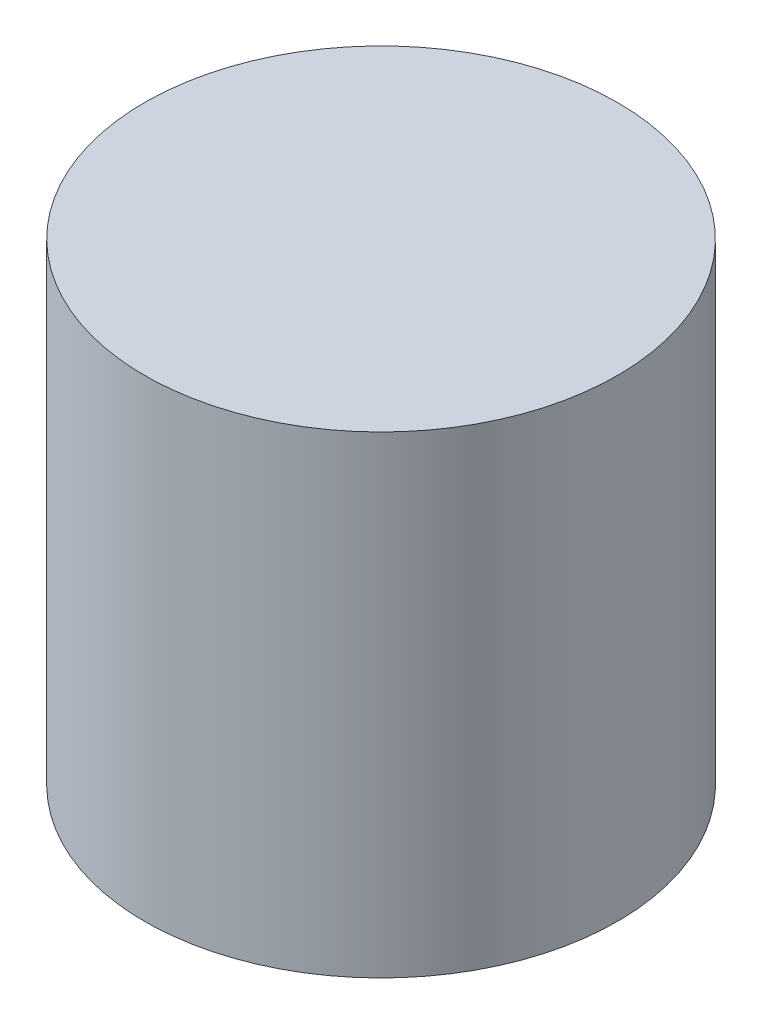
ISO-10303-21;
HEADER;
FILE_DESCRIPTION(('STEP AP214'),'2;1');
FILE_NAME('part.step','',(''),(''),'','','');
FILE_SCHEMA(('AUTOMOTIVE_DESIGN { 1 0 10303 214 1 1 1 1 }'));
ENDSEC;
DATA;
#1=APPLICATION_CONTEXT('core data for automotive mechanical design processes');
#2=APPLICATION_PROTOCOL_DEFINITION('international standard','automotive_design',2000,#1);
#3=PRODUCT_CONTEXT('',#1,'mechanical');
#4=PRODUCT('Part','Part','',(#3));
#5=PRODUCT_RELATED_PRODUCT_CATEGORY('part','',(#4));
#6=PRODUCT_DEFINITION_FORMATION('','',#4);
#7=PRODUCT_DEFINITION_CONTEXT('part definition',#1,'design');
#8=PRODUCT_DEFINITION('design','',#6,#7);
#9=PRODUCT_DEFINITION_SHAPE('','',#8);
#10=(LENGTH_UNIT() NAMED_UNIT(*) SI_UNIT(.MILLI.,.METRE.));
#11=(NAMED_UNIT(*) PLANE_ANGLE_UNIT() SI_UNIT($,.RADIAN.));
#12=(NAMED_UNIT(*) SI_UNIT($,.STERADIAN.) SOLID_ANGLE_UNIT());
#13=UNCERTAINTY_MEASURE_WITH_UNIT(LENGTH_MEASURE(1.E-05),#10,'distance_accuracy_value','');
#14=(GEOMETRIC_REPRESENTATION_CONTEXT(3) GLOBAL_UNCERTAINTY_ASSIGNED_CONTEXT((#13)) GLOBAL_UNIT_ASSIGNED_CONTEXT((#10,
#11,#12)) REPRESENTATION_CONTEXT('',''));
#15=CARTESIAN_POINT('',(0.,0.,0.));
#16=DIRECTION('',(0.,0.,1.));
#17=DIRECTION('',(1.,0.,0.));
#18=AXIS2_PLACEMENT_3D('',#15,#16,#17);
#19=CARTESIAN_POINT('',(0.,76.2,0.));
#20=DIRECTION('',(0.,-1.,0.));
#21=DIRECTION('',(0.,0.,-1.));
#22=AXIS2_PLACEMENT_3D('',#19,#20,#21);
#23=CYLINDRICAL_SURFACE('',#22,38.1);
#24=CARTESIAN_POINT('',(0.,76.2,0.));
#25=DIRECTION('',(0.,1.,0.));
#26=DIRECTION('',(0.,0.,1.));
#27=AXIS2_PLACEMENT_3D('',#24,#25,#26);
#28=CIRCLE('',#27,38.1);
#29=CARTESIAN_POINT('',(0.,76.2,-38.1));
#30=VERTEX_POINT('',#29);
#31=EDGE_CURVE('E10',#30,#30,#28,.T.);
#32=CARTESIAN_POINT('',(0.,0.,0.));
#33=DIRECTION('',(0.,1.,0.));
#34=DIRECTION('',(0.,0.,1.));
#35=AXIS2_PLACEMENT_3D('',#32,#33,#34);
#36=CIRCLE('',#35,38.1);
#37=CARTESIAN_POINT('',(0.,0.,-38.1));
#38=VERTEX_POINT('',#37);
#39=EDGE_CURVE('E33',#38,#38,#36,.T.);
#40=CARTESIAN_POINT('',(0.,76.2,-38.1));
#41=CARTESIAN_POINT('',(0.,75.40625,-38.1));
#42=CARTESIAN_POINT('',(0.,74.6125,-38.1));
#43=CARTESIAN_POINT('',(0.,73.025,-38.1));
#44=CARTESIAN_POINT('',(0.,72.23125,-38.1));
#45=CARTESIAN_POINT('',(0.,70.64375,-38.1));
#46=CARTESIAN_POINT('',(0.,69.85,-38.1));
#47=CARTESIAN_POINT('',(0.,68.2625,-38.1));
#48=CARTESIAN_POINT('',(0.,67.46875,-38.1));
#49=CARTESIAN_POINT('',(0.,65.88125,-38.1));
#50=CARTESIAN_POINT('',(0.,65.0875,-38.1));
#51=CARTESIAN_POINT('',(0.,63.5,-38.1));
#52=CARTESIAN_POINT('',(0.,62.70625,-38.1));
#53=CARTESIAN_POINT('',(0.,61.11875,-38.1));
#54=CARTESIAN_POINT('',(0.,60.325,-38.1));
#55=CARTESIAN_POINT('',(0.,58.7375,-38.1));
#56=CARTESIAN_POINT('',(0.,57.94375,-38.1));
#57=CARTESIAN_POINT('',(0.,56.35625,-38.1));
#58=CARTESIAN_POINT('',(0.,55.5625,-38.1));
#59=CARTESIAN_POINT('',(0.,53.975,-38.1));
#60=CARTESIAN_POINT('',(0.,53.18125,-38.1));
#61=CARTESIAN_POINT('',(0.,51.59375,-38.1));
#62=CARTESIAN_POINT('',(0.,50.8,-38.1));
#63=CARTESIAN_POINT('',(0.,49.2125,-38.1));
#64=CARTESIAN_POINT('',(0.,48.41875,-38.1));
#65=CARTESIAN_POINT('',(0.,46.83125,-38.1));
#66=CARTESIAN_POINT('',(0.,46.0375,-38.1));
#67=CARTESIAN_POINT('',(0.,44.45,-38.1));
#68=CARTESIAN_POINT('',(0.,43.65625,-38.1));
#69=CARTESIAN_POINT('',(0.,42.06875,-38.1));
#70=CARTESIAN_POINT('',(0.,41.275,-38.1));
#71=CARTESIAN_POINT('',(0.,39.6875,-38.1));
#72=CARTESIAN_POINT('',(0.,38.89375,-38.1));
#73=CARTESIAN_POINT('',(0.,37.30625,-38.1));
#74=CARTESIAN_POINT('',(0.,36.5125,-38.1));
#75=CARTESIAN_POINT('',(0.,34.925,-38.1));
#76=CARTESIAN_POINT('',(0.,34.13125,-38.1));
#77=CARTESIAN_POINT('',(0.,32.54375,-38.1));
#78=CARTESIAN_POINT('',(0.,31.75,-38.1));
#79=CARTESIAN_POINT('',(0.,30.1625,-38.1));
#80=CARTESIAN_POINT('',(0.,29.36875,-38.1));
#81=CARTESIAN_POINT('',(0.,27.78125,-38.1));
#82=CARTESIAN_POINT('',(0.,26.9875,-38.1));
#83=CARTESIAN_POINT('',(0.,25.4,-38.1));
#84=CARTESIAN_POINT('',(0.,24.60625,-38.1));
#85=CARTESIAN_POINT('',(0.,23.01875,-38.1));
#86=CARTESIAN_POINT('',(0.,22.225,-38.1));
#87=CARTESIAN_POINT('',(0.,20.6375,-38.1));
#88=CARTESIAN_POINT('',(0.,19.84375,-38.1));
#89=CARTESIAN_POINT('',(0.,18.25625,-38.1));
#90=CARTESIAN_POINT('',(0.,17.4625,-38.1));
#91=CARTESIAN_POINT('',(0.,15.875,-38.1));
#92=CARTESIAN_POINT('',(0.,15.08125,-38.1));
#93=CARTESIAN_POINT('',(0.,13.49375,-38.1));
#94=CARTESIAN_POINT('',(0.,12.7,-38.1));
#95=CARTESIAN_POINT('',(0.,11.1125,-38.1));
#96=CARTESIAN_POINT('',(0.,10.31875,-38.1));
#97=CARTESIAN_POINT('',(0.,8.73125,-38.1));
#98=CARTESIAN_POINT('',(0.,7.93750000000001,-38.1));
#99=CARTESIAN_POINT('',(0.,6.35,-38.1));
#100=CARTESIAN_POINT('',(0.,5.55625,-38.1));
#101=CARTESIAN_POINT('',(0.,3.96875,-38.1));
#102=CARTESIAN_POINT('',(0.,3.175,-38.1));
#103=CARTESIAN_POINT('',(0.,1.5875,-38.1));
#104=CARTESIAN_POINT('',(0.,0.793750000000001,-38.1));
#105=CARTESIAN_POINT('',(0.,0.,-38.1));
#106=B_SPLINE_CURVE_WITH_KNOTS('',3,(#40,#41,#42,#43,#44,#45,#46,#47,#48,#49,#50,#51,#52,#53,
#54,#55,#56,#57,#58,#59,#60,#61,#62,#63,#64,#65,#66,#67,#68,#69,#70,#71,#72,#73,#74,#75,#76,#77,
#78,#79,#80,#81,#82,#83,#84,#85,#86,#87,#88,#89,#90,#91,#92,#93,#94,#95,#96,#97,#98,#99,#100,
#101,#102,#103,#104,#105),.UNSPECIFIED.,.F.,.F.,(4,2,2,2,2,2,2,2,2,2,2,2,2,2,2,2,2,2,2,2,2,2,2,
2,2,2,2,2,2,2,2,2,4),(0.,2.38125,4.7625,7.14375,9.52500000000001,11.90625,14.2875,16.66875,
19.05,21.43125,23.8125,26.19375,28.575,30.95625,33.3375,35.71875,38.1,40.48125,42.8625,45.24375,
47.625,50.00625,52.3875,54.76875,57.15,59.53125,61.9125,64.29375,66.675,69.05625,71.4375,
73.81875,76.2),.UNSPECIFIED.);
#107=EDGE_CURVE('BSEAM30',#30,#38,#106,.T.);
#108=ORIENTED_EDGE('',*,*,#31,.F.);
#109=ORIENTED_EDGE('',*,*,#39,.T.);
#110=ORIENTED_EDGE('',*,*,#107,.T.);
#111=ORIENTED_EDGE('',*,*,#107,.F.);
#112=EDGE_LOOP('',(#108,#110,#109,#111));
#113=FACE_BOUND('',#112,.T.);
#114=ADVANCED_FACE('F30',(#113),#23,.T.);
#115=CARTESIAN_POINT('',(0.,76.2,0.));
#116=DIRECTION('',(0.,1.,0.));
#117=DIRECTION('',(0.,0.,1.));
#118=AXIS2_PLACEMENT_3D('',#115,#116,#117);
#119=PLANE('',#118);
#120=ORIENTED_EDGE('',*,*,#31,.T.);
#121=EDGE_LOOP('',(#120));
#122=FACE_BOUND('',#121,.T.);
#123=ADVANCED_FACE('F45',(#122),#119,.T.);
#124=CARTESIAN_POINT('',(0.,0.,0.));
#125=DIRECTION('',(0.,1.,0.));
#126=DIRECTION('',(0.,0.,1.));
#127=AXIS2_PLACEMENT_3D('',#124,#125,#126);
#128=PLANE('',#127);
#129=ORIENTED_EDGE('',*,*,#39,.F.);
#130=EDGE_LOOP('',(#129));
#131=FACE_BOUND('',#130,.T.);
#132=ADVANCED_FACE('F43',(#131),#128,.F.);
#133=CLOSED_SHELL('',(#114,#123,#132));
#134=MANIFOLD_SOLID_BREP('B2',#133);
#135=ADVANCED_BREP_SHAPE_REPRESENTATION('',(#18,#134),#14);
#136=SHAPE_DEFINITION_REPRESENTATION(#9,#135);
ENDSEC;
END-ISO-10303-21;
